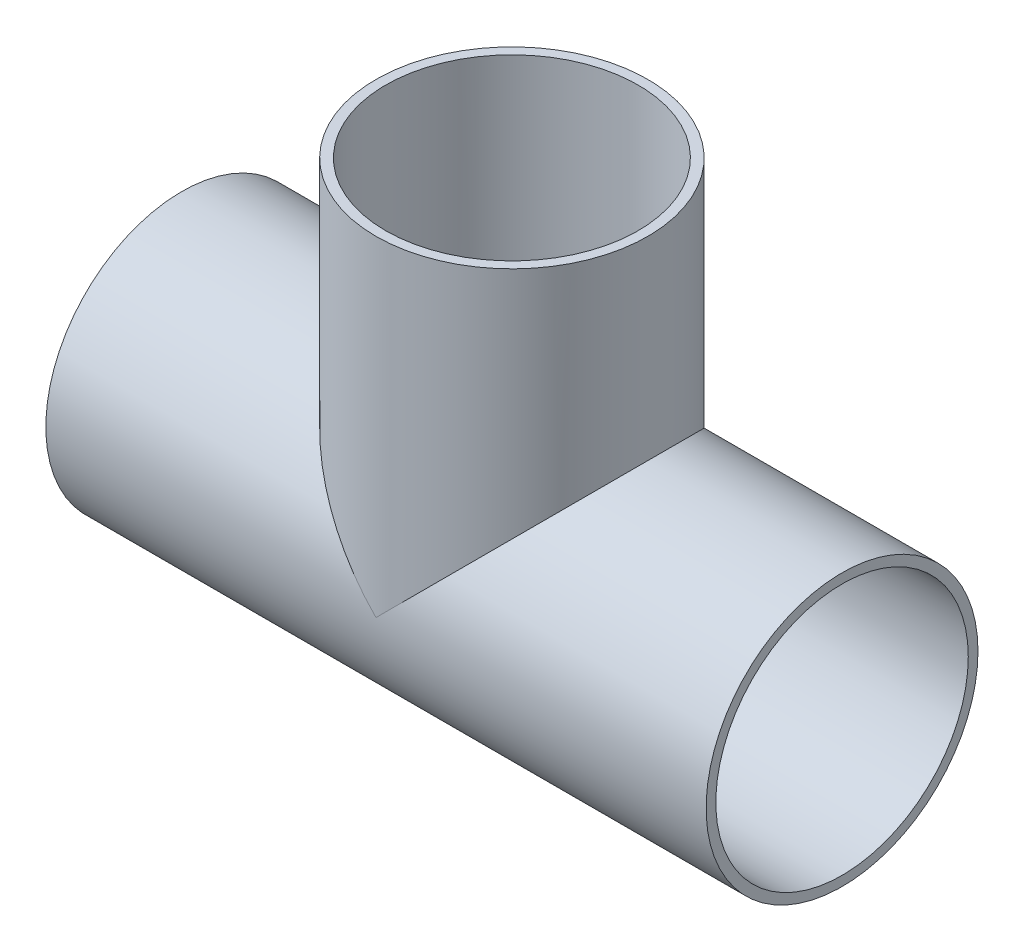
ISO-10303-21;
HEADER;
FILE_DESCRIPTION(('STEP AP214'),'2;1');
FILE_NAME('part.step','',(''),(''),'','','');
FILE_SCHEMA(('AUTOMOTIVE_DESIGN { 1 0 10303 214 1 1 1 1 }'));
ENDSEC;
DATA;
#1=APPLICATION_CONTEXT('core data for automotive mechanical design processes');
#2=APPLICATION_PROTOCOL_DEFINITION('international standard','automotive_design',2000,#1);
#3=PRODUCT_CONTEXT('',#1,'mechanical');
#4=PRODUCT('Part','Part','',(#3));
#5=PRODUCT_RELATED_PRODUCT_CATEGORY('part','',(#4));
#6=PRODUCT_DEFINITION_FORMATION('','',#4);
#7=PRODUCT_DEFINITION_CONTEXT('part definition',#1,'design');
#8=PRODUCT_DEFINITION('design','',#6,#7);
#9=PRODUCT_DEFINITION_SHAPE('','',#8);
#10=(LENGTH_UNIT() NAMED_UNIT(*) SI_UNIT(.MILLI.,.METRE.));
#11=(NAMED_UNIT(*) PLANE_ANGLE_UNIT() SI_UNIT($,.RADIAN.));
#12=(NAMED_UNIT(*) SI_UNIT($,.STERADIAN.) SOLID_ANGLE_UNIT());
#13=UNCERTAINTY_MEASURE_WITH_UNIT(LENGTH_MEASURE(1.E-05),#10,'distance_accuracy_value','');
#14=(GEOMETRIC_REPRESENTATION_CONTEXT(3) GLOBAL_UNCERTAINTY_ASSIGNED_CONTEXT((#13)) GLOBAL_UNIT_ASSIGNED_CONTEXT((#10,
#11,#12)) REPRESENTATION_CONTEXT('',''));
#15=CARTESIAN_POINT('',(0.,0.,0.));
#16=DIRECTION('',(0.,0.,1.));
#17=DIRECTION('',(1.,0.,0.));
#18=AXIS2_PLACEMENT_3D('',#15,#16,#17);
#19=CARTESIAN_POINT('',(170.,0.,0.));
#20=DIRECTION('',(-1.,0.,0.));
#21=DIRECTION('',(0.,0.,1.));
#22=AXIS2_PLACEMENT_3D('',#19,#20,#21);
#23=CYLINDRICAL_SURFACE('',#22,32.5);
#24=CARTESIAN_POINT('',(170.,0.,0.));
#25=DIRECTION('',(1.,0.,0.));
#26=DIRECTION('',(0.,0.,-1.));
#27=AXIS2_PLACEMENT_3D('',#24,#25,#26);
#28=CIRCLE('',#27,32.5);
#29=CARTESIAN_POINT('',(170.,0.,-32.5));
#30=VERTEX_POINT('',#29);
#31=EDGE_CURVE('E107',#30,#30,#28,.T.);
#32=ORIENTED_EDGE('',*,*,#31,.T.);
#33=EDGE_LOOP('',(#32));
#34=FACE_BOUND('',#33,.T.);
#35=CARTESIAN_POINT('',(0.,0.,0.));
#36=DIRECTION('',(1.,0.,0.));
#37=DIRECTION('',(0.,0.,-1.));
#38=AXIS2_PLACEMENT_3D('',#35,#36,#37);
#39=CIRCLE('',#38,32.5);
#40=CARTESIAN_POINT('',(0.,0.,-32.5));
#41=VERTEX_POINT('',#40);
#42=EDGE_CURVE('E105',#41,#41,#39,.T.);
#43=ORIENTED_EDGE('',*,*,#42,.F.);
#44=EDGE_LOOP('',(#43));
#45=FACE_BOUND('',#44,.T.);
#46=CARTESIAN_POINT('',(85.,0.,0.));
#47=DIRECTION('',(-0.707106781186547,0.707106781186547,0.));
#48=DIRECTION('',(-0.707106781186547,-0.707106781186547,0.));
#49=AXIS2_PLACEMENT_3D('',#46,#47,#48);
#50=ELLIPSE('',#49,45.9619407771256,32.5);
#51=CARTESIAN_POINT('',(85.,0.,32.5));
#52=VERTEX_POINT('',#51);
#53=CARTESIAN_POINT('',(85.,0.,-32.5));
#54=VERTEX_POINT('',#53);
#55=EDGE_CURVE('E54',#52,#54,#50,.T.);
#56=ORIENTED_EDGE('',*,*,#55,.T.);
#57=CARTESIAN_POINT('',(85.,0.,0.));
#58=DIRECTION('',(-0.707106781186547,-0.707106781186547,0.));
#59=DIRECTION('',(-0.707106781186547,0.707106781186547,0.));
#60=AXIS2_PLACEMENT_3D('',#57,#58,#59);
#61=ELLIPSE('',#60,45.9619407771256,32.5);
#62=EDGE_CURVE('E11',#54,#52,#61,.F.);
#63=ORIENTED_EDGE('',*,*,#62,.T.);
#64=EDGE_LOOP('',(#56,#63));
#65=FACE_BOUND('',#64,.T.);
#66=ADVANCED_FACE('F45',(#34,#45,#65),#23,.F.);
#67=CARTESIAN_POINT('',(170.,0.,0.));
#68=DIRECTION('',(-1.,0.,0.));
#69=DIRECTION('',(0.,0.,1.));
#70=AXIS2_PLACEMENT_3D('',#67,#68,#69);
#71=CYLINDRICAL_SURFACE('',#70,35.);
#72=CARTESIAN_POINT('',(0.,0.,0.));
#73=DIRECTION('',(1.,0.,0.));
#74=DIRECTION('',(0.,0.,-1.));
#75=AXIS2_PLACEMENT_3D('',#72,#73,#74);
#76=CIRCLE('',#75,35.);
#77=CARTESIAN_POINT('',(0.,0.,-35.));
#78=VERTEX_POINT('',#77);
#79=EDGE_CURVE('E102',#78,#78,#76,.T.);
#80=ORIENTED_EDGE('',*,*,#79,.T.);
#81=EDGE_LOOP('',(#80));
#82=FACE_BOUND('',#81,.T.);
#83=CARTESIAN_POINT('',(170.,0.,0.));
#84=DIRECTION('',(1.,0.,0.));
#85=DIRECTION('',(0.,0.,-1.));
#86=AXIS2_PLACEMENT_3D('',#83,#84,#85);
#87=CIRCLE('',#86,35.);
#88=CARTESIAN_POINT('',(170.,0.,-35.));
#89=VERTEX_POINT('',#88);
#90=EDGE_CURVE('E73',#89,#89,#87,.T.);
#91=ORIENTED_EDGE('',*,*,#90,.F.);
#92=EDGE_LOOP('',(#91));
#93=FACE_BOUND('',#92,.T.);
#94=CARTESIAN_POINT('',(85.,0.,0.));
#95=DIRECTION('',(-0.707106781186547,-0.707106781186547,0.));
#96=DIRECTION('',(-0.707106781186547,0.707106781186547,0.));
#97=AXIS2_PLACEMENT_3D('',#94,#95,#96);
#98=ELLIPSE('',#97,49.4974746830583,35.);
#99=CARTESIAN_POINT('',(85.,0.,-35.));
#100=VERTEX_POINT('',#99);
#101=CARTESIAN_POINT('',(85.,0.,35.));
#102=VERTEX_POINT('',#101);
#103=EDGE_CURVE('E108',#100,#102,#98,.F.);
#104=ORIENTED_EDGE('',*,*,#103,.F.);
#105=CARTESIAN_POINT('',(85.,0.,0.));
#106=DIRECTION('',(-0.707106781186547,0.707106781186547,0.));
#107=DIRECTION('',(-0.707106781186547,-0.707106781186547,0.));
#108=AXIS2_PLACEMENT_3D('',#105,#106,#107);
#109=ELLIPSE('',#108,49.4974746830583,35.);
#110=EDGE_CURVE('E65',#102,#100,#109,.T.);
#111=ORIENTED_EDGE('',*,*,#110,.F.);
#112=EDGE_LOOP('',(#104,#111));
#113=FACE_BOUND('',#112,.T.);
#114=ADVANCED_FACE('F47',(#82,#93,#113),#71,.T.);
#115=CARTESIAN_POINT('',(170.,0.,0.));
#116=DIRECTION('',(1.,0.,0.));
#117=DIRECTION('',(0.,0.,-1.));
#118=AXIS2_PLACEMENT_3D('',#115,#116,#117);
#119=PLANE('',#118);
#120=ORIENTED_EDGE('',*,*,#90,.T.);
#121=EDGE_LOOP('',(#120));
#122=FACE_BOUND('',#121,.T.);
#123=ORIENTED_EDGE('',*,*,#31,.F.);
#124=EDGE_LOOP('',(#123));
#125=FACE_BOUND('',#124,.T.);
#126=ADVANCED_FACE('F82',(#122,#125),#119,.T.);
#127=CARTESIAN_POINT('',(0.,0.,0.));
#128=DIRECTION('',(1.,0.,0.));
#129=DIRECTION('',(0.,0.,-1.));
#130=AXIS2_PLACEMENT_3D('',#127,#128,#129);
#131=PLANE('',#130);
#132=ORIENTED_EDGE('',*,*,#79,.F.);
#133=EDGE_LOOP('',(#132));
#134=FACE_BOUND('',#133,.T.);
#135=ORIENTED_EDGE('',*,*,#42,.T.);
#136=EDGE_LOOP('',(#135));
#137=FACE_BOUND('',#136,.T.);
#138=ADVANCED_FACE('F91',(#134,#137),#131,.F.);
#139=CARTESIAN_POINT('',(85.,85.,0.));
#140=DIRECTION('',(0.,-1.,0.));
#141=DIRECTION('',(0.,0.,-1.));
#142=AXIS2_PLACEMENT_3D('',#139,#140,#141);
#143=CYLINDRICAL_SURFACE('',#142,35.);
#144=CARTESIAN_POINT('',(85.,85.,0.));
#145=DIRECTION('',(0.,1.,0.));
#146=DIRECTION('',(0.,0.,1.));
#147=AXIS2_PLACEMENT_3D('',#144,#145,#146);
#148=CIRCLE('',#147,35.);
#149=CARTESIAN_POINT('',(85.,85.,35.));
#150=VERTEX_POINT('',#149);
#151=EDGE_CURVE('E123',#150,#150,#148,.T.);
#152=ORIENTED_EDGE('',*,*,#151,.F.);
#153=EDGE_LOOP('',(#152));
#154=FACE_BOUND('',#153,.T.);
#155=ORIENTED_EDGE('',*,*,#110,.T.);
#156=ORIENTED_EDGE('',*,*,#103,.T.);
#157=EDGE_LOOP('',(#155,#156));
#158=FACE_BOUND('',#157,.T.);
#159=ADVANCED_FACE('F88',(#154,#158),#143,.T.);
#160=CARTESIAN_POINT('',(85.,85.,0.));
#161=DIRECTION('',(0.,-1.,0.));
#162=DIRECTION('',(0.,0.,-1.));
#163=AXIS2_PLACEMENT_3D('',#160,#161,#162);
#164=CYLINDRICAL_SURFACE('',#163,32.5);
#165=CARTESIAN_POINT('',(85.,85.,0.));
#166=DIRECTION('',(0.,1.,0.));
#167=DIRECTION('',(0.,0.,1.));
#168=AXIS2_PLACEMENT_3D('',#165,#166,#167);
#169=CIRCLE('',#168,32.5);
#170=CARTESIAN_POINT('',(85.,85.,32.5));
#171=VERTEX_POINT('',#170);
#172=EDGE_CURVE('E127',#171,#171,#169,.T.);
#173=ORIENTED_EDGE('',*,*,#172,.T.);
#174=EDGE_LOOP('',(#173));
#175=FACE_BOUND('',#174,.T.);
#176=ORIENTED_EDGE('',*,*,#55,.F.);
#177=ORIENTED_EDGE('',*,*,#62,.F.);
#178=EDGE_LOOP('',(#176,#177));
#179=FACE_BOUND('',#178,.T.);
#180=ADVANCED_FACE('F70',(#175,#179),#164,.F.);
#181=CARTESIAN_POINT('',(85.,85.,0.));
#182=DIRECTION('',(0.,1.,0.));
#183=DIRECTION('',(0.,0.,1.));
#184=AXIS2_PLACEMENT_3D('',#181,#182,#183);
#185=PLANE('',#184);
#186=ORIENTED_EDGE('',*,*,#151,.T.);
#187=EDGE_LOOP('',(#186));
#188=FACE_BOUND('',#187,.T.);
#189=ORIENTED_EDGE('',*,*,#172,.F.);
#190=EDGE_LOOP('',(#189));
#191=FACE_BOUND('',#190,.T.);
#192=ADVANCED_FACE('F135',(#188,#191),#185,.T.);
#193=CLOSED_SHELL('',(#66,#114,#126,#138,#159,#180,#192));
#194=MANIFOLD_SOLID_BREP('B2',#193);
#195=ADVANCED_BREP_SHAPE_REPRESENTATION('',(#18,#194),#14);
#196=SHAPE_DEFINITION_REPRESENTATION(#9,#195);
ENDSEC;
END-ISO-10303-21;
